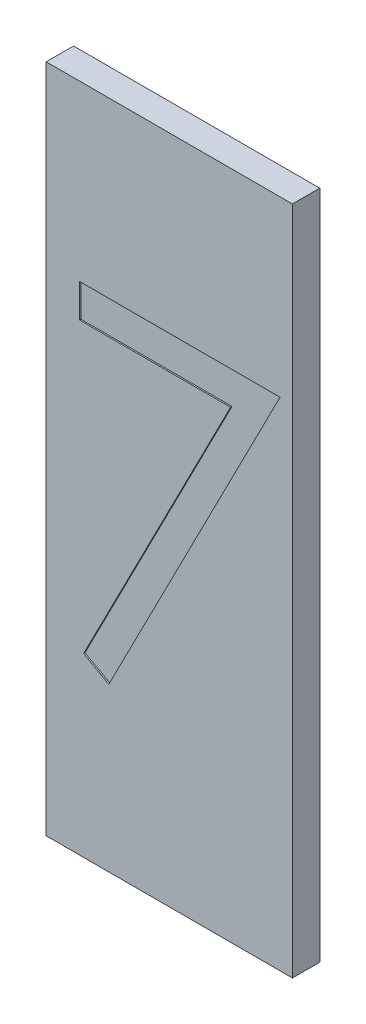
ISO-10303-21;
HEADER;
FILE_DESCRIPTION(('STEP AP214'),'2;1');
FILE_NAME('part.step','',(''),(''),'','','');
FILE_SCHEMA(('AUTOMOTIVE_DESIGN { 1 0 10303 214 1 1 1 1 }'));
ENDSEC;
DATA;
#1=APPLICATION_CONTEXT('core data for automotive mechanical design processes');
#2=APPLICATION_PROTOCOL_DEFINITION('international standard','automotive_design',2000,#1);
#3=PRODUCT_CONTEXT('',#1,'mechanical');
#4=PRODUCT('Part','Part','',(#3));
#5=PRODUCT_RELATED_PRODUCT_CATEGORY('part','',(#4));
#6=PRODUCT_DEFINITION_FORMATION('','',#4);
#7=PRODUCT_DEFINITION_CONTEXT('part definition',#1,'design');
#8=PRODUCT_DEFINITION('design','',#6,#7);
#9=PRODUCT_DEFINITION_SHAPE('','',#8);
#10=(LENGTH_UNIT() NAMED_UNIT(*) SI_UNIT(.MILLI.,.METRE.));
#11=(NAMED_UNIT(*) PLANE_ANGLE_UNIT() SI_UNIT($,.RADIAN.));
#12=(NAMED_UNIT(*) SI_UNIT($,.STERADIAN.) SOLID_ANGLE_UNIT());
#13=UNCERTAINTY_MEASURE_WITH_UNIT(LENGTH_MEASURE(1.E-05),#10,'distance_accuracy_value','');
#14=(GEOMETRIC_REPRESENTATION_CONTEXT(3) GLOBAL_UNCERTAINTY_ASSIGNED_CONTEXT((#13)) GLOBAL_UNIT_ASSIGNED_CONTEXT((#10,
#11,#12)) REPRESENTATION_CONTEXT('',''));
#15=CARTESIAN_POINT('',(0.,0.,0.));
#16=DIRECTION('',(0.,0.,1.));
#17=DIRECTION('',(1.,0.,0.));
#18=AXIS2_PLACEMENT_3D('',#15,#16,#17);
#19=CARTESIAN_POINT('',(0.,0.,2.));
#20=DIRECTION('',(0.,0.,1.));
#21=DIRECTION('',(1.,0.,0.));
#22=AXIS2_PLACEMENT_3D('',#19,#20,#21);
#23=PLANE('',#22);
#24=DIRECTION('',(0.,-1.,0.));
#25=VECTOR('',#24,1.);
#26=CARTESIAN_POINT('',(0.,0.,2.));
#27=LINE('',#26,#25);
#28=CARTESIAN_POINT('',(0.,49.,2.));
#29=VERTEX_POINT('',#28);
#30=CARTESIAN_POINT('',(0.,0.,2.));
#31=VERTEX_POINT('',#30);
#32=EDGE_CURVE('E150',#29,#31,#27,.T.);
#33=ORIENTED_EDGE('',*,*,#32,.T.);
#34=DIRECTION('',(1.,0.,0.));
#35=VECTOR('',#34,1.);
#36=CARTESIAN_POINT('',(18.,0.,2.));
#37=LINE('',#36,#35);
#38=CARTESIAN_POINT('',(18.,0.,2.));
#39=VERTEX_POINT('',#38);
#40=EDGE_CURVE('E85',#31,#39,#37,.T.);
#41=ORIENTED_EDGE('',*,*,#40,.T.);
#42=DIRECTION('',(0.,1.,0.));
#43=VECTOR('',#42,1.);
#44=CARTESIAN_POINT('',(18.,0.,2.));
#45=LINE('',#44,#43);
#46=CARTESIAN_POINT('',(18.,49.,2.));
#47=VERTEX_POINT('',#46);
#48=EDGE_CURVE('E153',#39,#47,#45,.T.);
#49=ORIENTED_EDGE('',*,*,#48,.T.);
#50=DIRECTION('',(-1.,0.,0.));
#51=VECTOR('',#50,1.);
#52=CARTESIAN_POINT('',(18.,49.,2.));
#53=LINE('',#52,#51);
#54=EDGE_CURVE('E57',#47,#29,#53,.T.);
#55=ORIENTED_EDGE('',*,*,#54,.T.);
#56=EDGE_LOOP('',(#33,#41,#49,#55));
#57=FACE_BOUND('',#56,.T.);
#58=DIRECTION('',(-1.,0.,0.));
#59=VECTOR('',#58,1.);
#60=CARTESIAN_POINT('',(13.4803936298077,33.8701923076923,2.));
#61=LINE('',#60,#59);
#62=CARTESIAN_POINT('',(13.4803936298077,33.8701923076923,2.));
#63=VERTEX_POINT('',#62);
#64=CARTESIAN_POINT('',(2.44230769230769,33.8701923076923,2.));
#65=VERTEX_POINT('',#64);
#66=EDGE_CURVE('E135',#63,#65,#61,.T.);
#67=ORIENTED_EDGE('',*,*,#66,.T.);
#68=DIRECTION('',(0.,1.,0.));
#69=VECTOR('',#68,1.);
#70=CARTESIAN_POINT('',(2.44230769230769,33.8701923076923,2.));
#71=LINE('',#70,#69);
#72=CARTESIAN_POINT('',(2.44230769230769,36.3125,2.));
#73=VERTEX_POINT('',#72);
#74=EDGE_CURVE('E48',#65,#73,#71,.T.);
#75=ORIENTED_EDGE('',*,*,#74,.T.);
#76=DIRECTION('',(1.,0.,0.));
#77=VECTOR('',#76,1.);
#78=CARTESIAN_POINT('',(2.44230769230769,36.3125,2.));
#79=LINE('',#78,#77);
#80=CARTESIAN_POINT('',(17.0961538461538,36.3125,2.));
#81=VERTEX_POINT('',#80);
#82=EDGE_CURVE('E139',#73,#81,#79,.T.);
#83=ORIENTED_EDGE('',*,*,#82,.T.);
#84=DIRECTION('',(-0.456090790910399,-0.889933250556876,0.));
#85=VECTOR('',#84,1.);
#86=CARTESIAN_POINT('',(17.0961538461538,36.3125,2.));
#87=LINE('',#86,#85);
#88=CARTESIAN_POINT('',(4.57932692307692,11.8894230769231,2.));
#89=VERTEX_POINT('',#88);
#90=EDGE_CURVE('E305',#81,#89,#87,.T.);
#91=ORIENTED_EDGE('',*,*,#90,.T.);
#92=DIRECTION('',(-0.87607248437468,0.482179429384514,0.));
#93=VECTOR('',#92,1.);
#94=CARTESIAN_POINT('',(4.57932692307692,11.8894230769231,2.));
#95=LINE('',#94,#93);
#96=CARTESIAN_POINT('',(2.73328575721154,12.9054612379808,2.));
#97=VERTEX_POINT('',#96);
#98=EDGE_CURVE('E302',#89,#97,#95,.T.);
#99=ORIENTED_EDGE('',*,*,#98,.T.);
#100=DIRECTION('',(0.456180989989924,0.889887017756643,0.));
#101=VECTOR('',#100,1.);
#102=CARTESIAN_POINT('',(2.73328575721154,12.9054612379808,2.));
#103=LINE('',#102,#101);
#104=EDGE_CURVE('E296',#97,#63,#103,.T.);
#105=ORIENTED_EDGE('',*,*,#104,.T.);
#106=EDGE_LOOP('',(#67,#75,#83,#91,#99,#105));
#107=FACE_BOUND('',#106,.T.);
#108=ADVANCED_FACE('F33',(#57,#107),#23,.T.);
#109=CARTESIAN_POINT('',(0.,0.,2.));
#110=DIRECTION('',(1.,0.,0.));
#111=DIRECTION('',(0.,0.,-1.));
#112=AXIS2_PLACEMENT_3D('',#109,#110,#111);
#113=PLANE('',#112);
#114=DIRECTION('',(0.,-1.,0.));
#115=VECTOR('',#114,1.);
#116=CARTESIAN_POINT('',(0.,0.,0.));
#117=LINE('',#116,#115);
#118=CARTESIAN_POINT('',(0.,49.,0.));
#119=VERTEX_POINT('',#118);
#120=CARTESIAN_POINT('',(0.,0.,0.));
#121=VERTEX_POINT('',#120);
#122=EDGE_CURVE('E140',#119,#121,#117,.T.);
#123=ORIENTED_EDGE('',*,*,#122,.T.);
#124=DIRECTION('',(0.,0.,-1.));
#125=VECTOR('',#124,1.);
#126=CARTESIAN_POINT('',(0.,0.,2.));
#127=LINE('',#126,#125);
#128=EDGE_CURVE('E11',#31,#121,#127,.T.);
#129=ORIENTED_EDGE('',*,*,#128,.F.);
#130=ORIENTED_EDGE('',*,*,#32,.F.);
#131=DIRECTION('',(0.,0.,-1.));
#132=VECTOR('',#131,1.);
#133=CARTESIAN_POINT('',(0.,49.,2.));
#134=LINE('',#133,#132);
#135=EDGE_CURVE('E155',#29,#119,#134,.T.);
#136=ORIENTED_EDGE('',*,*,#135,.T.);
#137=EDGE_LOOP('',(#123,#129,#130,#136));
#138=FACE_BOUND('',#137,.T.);
#139=ADVANCED_FACE('F35',(#138),#113,.F.);
#140=CARTESIAN_POINT('',(18.,0.,2.));
#141=DIRECTION('',(0.,1.,0.));
#142=DIRECTION('',(0.,0.,1.));
#143=AXIS2_PLACEMENT_3D('',#140,#141,#142);
#144=PLANE('',#143);
#145=DIRECTION('',(1.,0.,0.));
#146=VECTOR('',#145,1.);
#147=CARTESIAN_POINT('',(18.,0.,0.));
#148=LINE('',#147,#146);
#149=CARTESIAN_POINT('',(18.,0.,0.));
#150=VERTEX_POINT('',#149);
#151=EDGE_CURVE('E144',#121,#150,#148,.T.);
#152=ORIENTED_EDGE('',*,*,#151,.T.);
#153=DIRECTION('',(0.,0.,-1.));
#154=VECTOR('',#153,1.);
#155=CARTESIAN_POINT('',(18.,0.,2.));
#156=LINE('',#155,#154);
#157=EDGE_CURVE('E41',#39,#150,#156,.T.);
#158=ORIENTED_EDGE('',*,*,#157,.F.);
#159=ORIENTED_EDGE('',*,*,#40,.F.);
#160=ORIENTED_EDGE('',*,*,#128,.T.);
#161=EDGE_LOOP('',(#152,#158,#159,#160));
#162=FACE_BOUND('',#161,.T.);
#163=ADVANCED_FACE('F183',(#162),#144,.F.);
#164=CARTESIAN_POINT('',(18.,0.,2.));
#165=DIRECTION('',(-1.,0.,0.));
#166=DIRECTION('',(0.,0.,1.));
#167=AXIS2_PLACEMENT_3D('',#164,#165,#166);
#168=PLANE('',#167);
#169=DIRECTION('',(0.,1.,0.));
#170=VECTOR('',#169,1.);
#171=CARTESIAN_POINT('',(18.,0.,0.));
#172=LINE('',#171,#170);
#173=CARTESIAN_POINT('',(18.,49.,0.));
#174=VERTEX_POINT('',#173);
#175=EDGE_CURVE('E158',#150,#174,#172,.T.);
#176=ORIENTED_EDGE('',*,*,#175,.T.);
#177=DIRECTION('',(0.,0.,-1.));
#178=VECTOR('',#177,1.);
#179=CARTESIAN_POINT('',(18.,49.,2.));
#180=LINE('',#179,#178);
#181=EDGE_CURVE('E162',#47,#174,#180,.T.);
#182=ORIENTED_EDGE('',*,*,#181,.F.);
#183=ORIENTED_EDGE('',*,*,#48,.F.);
#184=ORIENTED_EDGE('',*,*,#157,.T.);
#185=EDGE_LOOP('',(#176,#182,#183,#184));
#186=FACE_BOUND('',#185,.T.);
#187=ADVANCED_FACE('F167',(#186),#168,.F.);
#188=CARTESIAN_POINT('',(18.,49.,2.));
#189=DIRECTION('',(0.,-1.,0.));
#190=DIRECTION('',(0.,0.,-1.));
#191=AXIS2_PLACEMENT_3D('',#188,#189,#190);
#192=PLANE('',#191);
#193=DIRECTION('',(-1.,0.,0.));
#194=VECTOR('',#193,1.);
#195=CARTESIAN_POINT('',(18.,49.,0.));
#196=LINE('',#195,#194);
#197=EDGE_CURVE('E78',#174,#119,#196,.T.);
#198=ORIENTED_EDGE('',*,*,#197,.T.);
#199=ORIENTED_EDGE('',*,*,#135,.F.);
#200=ORIENTED_EDGE('',*,*,#54,.F.);
#201=ORIENTED_EDGE('',*,*,#181,.T.);
#202=EDGE_LOOP('',(#198,#199,#200,#201));
#203=FACE_BOUND('',#202,.T.);
#204=ADVANCED_FACE('F175',(#203),#192,.F.);
#205=CARTESIAN_POINT('',(0.,0.,0.));
#206=DIRECTION('',(0.,0.,1.));
#207=DIRECTION('',(1.,0.,0.));
#208=AXIS2_PLACEMENT_3D('',#205,#206,#207);
#209=PLANE('',#208);
#210=ORIENTED_EDGE('',*,*,#122,.F.);
#211=ORIENTED_EDGE('',*,*,#197,.F.);
#212=ORIENTED_EDGE('',*,*,#175,.F.);
#213=ORIENTED_EDGE('',*,*,#151,.F.);
#214=EDGE_LOOP('',(#210,#211,#212,#213));
#215=FACE_BOUND('',#214,.T.);
#216=ADVANCED_FACE('F171',(#215),#209,.F.);
#217=CARTESIAN_POINT('',(2.44230769230769,33.8701923076923,1.9));
#218=DIRECTION('',(1.,0.,0.));
#219=DIRECTION('',(0.,0.,-1.));
#220=AXIS2_PLACEMENT_3D('',#217,#218,#219);
#221=PLANE('',#220);
#222=ORIENTED_EDGE('',*,*,#74,.F.);
#223=DIRECTION('',(0.,0.,1.));
#224=VECTOR('',#223,1.);
#225=CARTESIAN_POINT('',(2.44230769230769,33.8701923076923,1.9));
#226=LINE('',#225,#224);
#227=CARTESIAN_POINT('',(2.44230769230769,33.8701923076923,1.9));
#228=VERTEX_POINT('',#227);
#229=EDGE_CURVE('E134',#228,#65,#226,.T.);
#230=ORIENTED_EDGE('',*,*,#229,.F.);
#231=DIRECTION('',(0.,1.,0.));
#232=VECTOR('',#231,1.);
#233=CARTESIAN_POINT('',(2.44230769230769,33.8701923076923,1.9));
#234=LINE('',#233,#232);
#235=CARTESIAN_POINT('',(2.44230769230769,36.3125,1.9));
#236=VERTEX_POINT('',#235);
#237=EDGE_CURVE('E125',#228,#236,#234,.T.);
#238=ORIENTED_EDGE('',*,*,#237,.T.);
#239=DIRECTION('',(0.,0.,1.));
#240=VECTOR('',#239,1.);
#241=CARTESIAN_POINT('',(2.44230769230769,36.3125,1.9));
#242=LINE('',#241,#240);
#243=EDGE_CURVE('E133',#236,#73,#242,.T.);
#244=ORIENTED_EDGE('',*,*,#243,.T.);
#245=EDGE_LOOP('',(#222,#230,#238,#244));
#246=FACE_BOUND('',#245,.T.);
#247=ADVANCED_FACE('F132',(#246),#221,.T.);
#248=CARTESIAN_POINT('',(2.44230769230769,36.3125,1.9));
#249=DIRECTION('',(0.,-1.,0.));
#250=DIRECTION('',(0.,0.,-1.));
#251=AXIS2_PLACEMENT_3D('',#248,#249,#250);
#252=PLANE('',#251);
#253=ORIENTED_EDGE('',*,*,#82,.F.);
#254=ORIENTED_EDGE('',*,*,#243,.F.);
#255=DIRECTION('',(1.,0.,0.));
#256=VECTOR('',#255,1.);
#257=CARTESIAN_POINT('',(2.44230769230769,36.3125,1.9));
#258=LINE('',#257,#256);
#259=CARTESIAN_POINT('',(17.0961538461538,36.3125,1.9));
#260=VERTEX_POINT('',#259);
#261=EDGE_CURVE('E121',#236,#260,#258,.T.);
#262=ORIENTED_EDGE('',*,*,#261,.T.);
#263=DIRECTION('',(0.,0.,1.));
#264=VECTOR('',#263,1.);
#265=CARTESIAN_POINT('',(17.0961538461538,36.3125,1.9));
#266=LINE('',#265,#264);
#267=EDGE_CURVE('E141',#260,#81,#266,.T.);
#268=ORIENTED_EDGE('',*,*,#267,.T.);
#269=EDGE_LOOP('',(#253,#254,#262,#268));
#270=FACE_BOUND('',#269,.T.);
#271=ADVANCED_FACE('F137',(#270),#252,.T.);
#272=CARTESIAN_POINT('',(17.0961538461538,36.3125,1.9));
#273=DIRECTION('',(-0.889933250556876,0.456090790910399,0.));
#274=DIRECTION('',(-0.456090790910399,-0.889933250556876,0.));
#275=AXIS2_PLACEMENT_3D('',#272,#273,#274);
#276=PLANE('',#275);
#277=ORIENTED_EDGE('',*,*,#90,.F.);
#278=ORIENTED_EDGE('',*,*,#267,.F.);
#279=DIRECTION('',(-0.456090790910399,-0.889933250556876,0.));
#280=VECTOR('',#279,1.);
#281=CARTESIAN_POINT('',(17.0961538461538,36.3125,1.9));
#282=LINE('',#281,#280);
#283=CARTESIAN_POINT('',(4.57932692307692,11.8894230769231,1.9));
#284=VERTEX_POINT('',#283);
#285=EDGE_CURVE('E127',#260,#284,#282,.T.);
#286=ORIENTED_EDGE('',*,*,#285,.T.);
#287=DIRECTION('',(0.,0.,1.));
#288=VECTOR('',#287,1.);
#289=CARTESIAN_POINT('',(4.57932692307692,11.8894230769231,1.9));
#290=LINE('',#289,#288);
#291=EDGE_CURVE('E146',#284,#89,#290,.T.);
#292=ORIENTED_EDGE('',*,*,#291,.T.);
#293=EDGE_LOOP('',(#277,#278,#286,#292));
#294=FACE_BOUND('',#293,.T.);
#295=ADVANCED_FACE('F196',(#294),#276,.T.);
#296=CARTESIAN_POINT('',(4.57932692307692,11.8894230769231,1.9));
#297=DIRECTION('',(0.482179429384515,0.87607248437468,0.));
#298=DIRECTION('',(-0.87607248437468,0.482179429384515,0.));
#299=AXIS2_PLACEMENT_3D('',#296,#297,#298);
#300=PLANE('',#299);
#301=ORIENTED_EDGE('',*,*,#98,.F.);
#302=ORIENTED_EDGE('',*,*,#291,.F.);
#303=DIRECTION('',(-0.87607248437468,0.482179429384514,0.));
#304=VECTOR('',#303,1.);
#305=CARTESIAN_POINT('',(4.57932692307692,11.8894230769231,1.9));
#306=LINE('',#305,#304);
#307=CARTESIAN_POINT('',(2.73328575721154,12.9054612379808,1.9));
#308=VERTEX_POINT('',#307);
#309=EDGE_CURVE('E321',#284,#308,#306,.T.);
#310=ORIENTED_EDGE('',*,*,#309,.T.);
#311=DIRECTION('',(0.,0.,1.));
#312=VECTOR('',#311,1.);
#313=CARTESIAN_POINT('',(2.73328575721154,12.9054612379808,1.9));
#314=LINE('',#313,#312);
#315=EDGE_CURVE('E312',#308,#97,#314,.T.);
#316=ORIENTED_EDGE('',*,*,#315,.T.);
#317=EDGE_LOOP('',(#301,#302,#310,#316));
#318=FACE_BOUND('',#317,.T.);
#319=ADVANCED_FACE('F199',(#318),#300,.T.);
#320=CARTESIAN_POINT('',(2.73328575721154,12.9054612379808,1.9));
#321=DIRECTION('',(0.889887017756643,-0.456180989989924,0.));
#322=DIRECTION('',(0.456180989989924,0.889887017756643,0.));
#323=AXIS2_PLACEMENT_3D('',#320,#321,#322);
#324=PLANE('',#323);
#325=ORIENTED_EDGE('',*,*,#104,.F.);
#326=ORIENTED_EDGE('',*,*,#315,.F.);
#327=DIRECTION('',(0.456180989989924,0.889887017756643,0.));
#328=VECTOR('',#327,1.);
#329=CARTESIAN_POINT('',(2.73328575721154,12.9054612379808,1.9));
#330=LINE('',#329,#328);
#331=CARTESIAN_POINT('',(13.4803936298077,33.8701923076923,1.9));
#332=VERTEX_POINT('',#331);
#333=EDGE_CURVE('E319',#308,#332,#330,.T.);
#334=ORIENTED_EDGE('',*,*,#333,.T.);
#335=DIRECTION('',(0.,0.,1.));
#336=VECTOR('',#335,1.);
#337=CARTESIAN_POINT('',(13.4803936298077,33.8701923076923,1.9));
#338=LINE('',#337,#336);
#339=EDGE_CURVE('E295',#332,#63,#338,.T.);
#340=ORIENTED_EDGE('',*,*,#339,.T.);
#341=EDGE_LOOP('',(#325,#326,#334,#340));
#342=FACE_BOUND('',#341,.T.);
#343=ADVANCED_FACE('F203',(#342),#324,.T.);
#344=CARTESIAN_POINT('',(13.4803936298077,33.8701923076923,1.9));
#345=DIRECTION('',(0.,1.,0.));
#346=DIRECTION('',(0.,0.,1.));
#347=AXIS2_PLACEMENT_3D('',#344,#345,#346);
#348=PLANE('',#347);
#349=ORIENTED_EDGE('',*,*,#66,.F.);
#350=ORIENTED_EDGE('',*,*,#339,.F.);
#351=DIRECTION('',(-1.,0.,0.));
#352=VECTOR('',#351,1.);
#353=CARTESIAN_POINT('',(13.4803936298077,33.8701923076923,1.9));
#354=LINE('',#353,#352);
#355=EDGE_CURVE('E310',#332,#228,#354,.T.);
#356=ORIENTED_EDGE('',*,*,#355,.T.);
#357=ORIENTED_EDGE('',*,*,#229,.T.);
#358=EDGE_LOOP('',(#349,#350,#356,#357));
#359=FACE_BOUND('',#358,.T.);
#360=ADVANCED_FACE('F207',(#359),#348,.T.);
#361=CARTESIAN_POINT('',(0.,0.,1.9));
#362=DIRECTION('',(0.,0.,-1.));
#363=DIRECTION('',(-1.,0.,0.));
#364=AXIS2_PLACEMENT_3D('',#361,#362,#363);
#365=PLANE('',#364);
#366=ORIENTED_EDGE('',*,*,#237,.F.);
#367=ORIENTED_EDGE('',*,*,#355,.F.);
#368=ORIENTED_EDGE('',*,*,#333,.F.);
#369=ORIENTED_EDGE('',*,*,#309,.F.);
#370=ORIENTED_EDGE('',*,*,#285,.F.);
#371=ORIENTED_EDGE('',*,*,#261,.F.);
#372=EDGE_LOOP('',(#366,#367,#368,#369,#370,#371));
#373=FACE_BOUND('',#372,.T.);
#374=ADVANCED_FACE('F123',(#373),#365,.F.);
#375=CLOSED_SHELL('',(#108,#139,#163,#187,#204,#216,#247,#271,#295,#319,#343,#360,#374));
#376=MANIFOLD_SOLID_BREP('B2',#375);
#377=ADVANCED_BREP_SHAPE_REPRESENTATION('',(#18,#376),#14);
#378=SHAPE_DEFINITION_REPRESENTATION(#9,#377);
ENDSEC;
END-ISO-10303-21;
